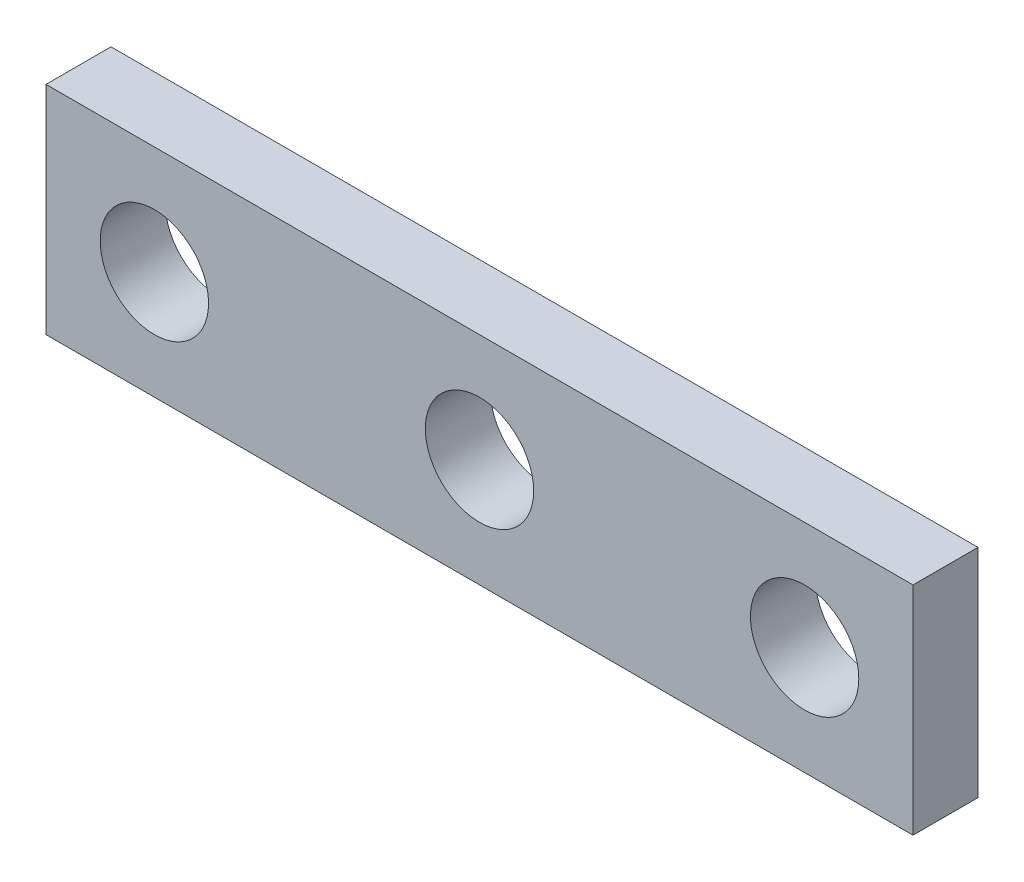
ISO-10303-21;
HEADER;
FILE_DESCRIPTION(('STEP AP214'),'2;1');
FILE_NAME('part.step','',(''),(''),'','','');
FILE_SCHEMA(('AUTOMOTIVE_DESIGN { 1 0 10303 214 1 1 1 1 }'));
ENDSEC;
DATA;
#1=APPLICATION_CONTEXT('core data for automotive mechanical design processes');
#2=APPLICATION_PROTOCOL_DEFINITION('international standard','automotive_design',2000,#1);
#3=PRODUCT_CONTEXT('',#1,'mechanical');
#4=PRODUCT('Part','Part','',(#3));
#5=PRODUCT_RELATED_PRODUCT_CATEGORY('part','',(#4));
#6=PRODUCT_DEFINITION_FORMATION('','',#4);
#7=PRODUCT_DEFINITION_CONTEXT('part definition',#1,'design');
#8=PRODUCT_DEFINITION('design','',#6,#7);
#9=PRODUCT_DEFINITION_SHAPE('','',#8);
#10=(LENGTH_UNIT() NAMED_UNIT(*) SI_UNIT(.MILLI.,.METRE.));
#11=(NAMED_UNIT(*) PLANE_ANGLE_UNIT() SI_UNIT($,.RADIAN.));
#12=(NAMED_UNIT(*) SI_UNIT($,.STERADIAN.) SOLID_ANGLE_UNIT());
#13=UNCERTAINTY_MEASURE_WITH_UNIT(LENGTH_MEASURE(1.E-05),#10,'distance_accuracy_value','');
#14=(GEOMETRIC_REPRESENTATION_CONTEXT(3) GLOBAL_UNCERTAINTY_ASSIGNED_CONTEXT((#13)) GLOBAL_UNIT_ASSIGNED_CONTEXT((#10,
#11,#12)) REPRESENTATION_CONTEXT('',''));
#15=CARTESIAN_POINT('',(0.,0.,0.));
#16=DIRECTION('',(0.,0.,1.));
#17=DIRECTION('',(1.,0.,0.));
#18=AXIS2_PLACEMENT_3D('',#15,#16,#17);
#19=CARTESIAN_POINT('',(0.,0.,3.));
#20=DIRECTION('',(0.,0.,-1.));
#21=DIRECTION('',(-1.,0.,0.));
#22=AXIS2_PLACEMENT_3D('',#19,#20,#21);
#23=PLANE('',#22);
#24=DIRECTION('',(0.,1.,0.));
#25=VECTOR('',#24,1.);
#26=CARTESIAN_POINT('',(20.,-5.,3.));
#27=LINE('',#26,#25);
#28=CARTESIAN_POINT('',(20.,-5.,3.));
#29=VERTEX_POINT('',#28);
#30=CARTESIAN_POINT('',(20.,5.,3.));
#31=VERTEX_POINT('',#30);
#32=EDGE_CURVE('E85',#29,#31,#27,.T.);
#33=ORIENTED_EDGE('',*,*,#32,.T.);
#34=DIRECTION('',(-1.,0.,0.));
#35=VECTOR('',#34,1.);
#36=CARTESIAN_POINT('',(-20.,5.,3.));
#37=LINE('',#36,#35);
#38=CARTESIAN_POINT('',(-20.,5.,3.));
#39=VERTEX_POINT('',#38);
#40=EDGE_CURVE('E80',#31,#39,#37,.T.);
#41=ORIENTED_EDGE('',*,*,#40,.T.);
#42=DIRECTION('',(0.,-1.,0.));
#43=VECTOR('',#42,1.);
#44=CARTESIAN_POINT('',(-20.,-5.,3.));
#45=LINE('',#44,#43);
#46=CARTESIAN_POINT('',(-20.,-5.,3.));
#47=VERTEX_POINT('',#46);
#48=EDGE_CURVE('E83',#39,#47,#45,.T.);
#49=ORIENTED_EDGE('',*,*,#48,.T.);
#50=DIRECTION('',(1.,0.,0.));
#51=VECTOR('',#50,1.);
#52=CARTESIAN_POINT('',(-20.,-5.,3.));
#53=LINE('',#52,#51);
#54=EDGE_CURVE('E50',#47,#29,#53,.T.);
#55=ORIENTED_EDGE('',*,*,#54,.T.);
#56=EDGE_LOOP('',(#33,#41,#49,#55));
#57=FACE_BOUND('',#56,.T.);
#58=CARTESIAN_POINT('',(-15.,0.,3.));
#59=DIRECTION('',(0.,0.,1.));
#60=DIRECTION('',(1.,0.,0.));
#61=AXIS2_PLACEMENT_3D('',#58,#59,#60);
#62=CIRCLE('',#61,2.5);
#63=CARTESIAN_POINT('',(-12.5,0.,3.));
#64=VERTEX_POINT('',#63);
#65=EDGE_CURVE('E100',#64,#64,#62,.T.);
#66=ORIENTED_EDGE('',*,*,#65,.F.);
#67=EDGE_LOOP('',(#66));
#68=FACE_BOUND('',#67,.T.);
#69=CARTESIAN_POINT('',(15.,0.,3.));
#70=DIRECTION('',(0.,0.,1.));
#71=DIRECTION('',(1.,0.,0.));
#72=AXIS2_PLACEMENT_3D('',#69,#70,#71);
#73=CIRCLE('',#72,2.5);
#74=CARTESIAN_POINT('',(17.5,0.,3.));
#75=VERTEX_POINT('',#74);
#76=EDGE_CURVE('E115',#75,#75,#73,.T.);
#77=ORIENTED_EDGE('',*,*,#76,.F.);
#78=EDGE_LOOP('',(#77));
#79=FACE_BOUND('',#78,.T.);
#80=CARTESIAN_POINT('',(0.,0.,3.));
#81=DIRECTION('',(0.,0.,1.));
#82=DIRECTION('',(1.,0.,0.));
#83=AXIS2_PLACEMENT_3D('',#80,#81,#82);
#84=CIRCLE('',#83,2.5);
#85=CARTESIAN_POINT('',(2.49999999999999,0.,3.));
#86=VERTEX_POINT('',#85);
#87=EDGE_CURVE('E121',#86,#86,#84,.T.);
#88=ORIENTED_EDGE('',*,*,#87,.F.);
#89=EDGE_LOOP('',(#88));
#90=FACE_BOUND('',#89,.T.);
#91=ADVANCED_FACE('F33',(#57,#68,#79,#90),#23,.F.);
#92=CARTESIAN_POINT('',(0.,0.,0.));
#93=DIRECTION('',(0.,0.,-1.));
#94=DIRECTION('',(-1.,0.,0.));
#95=AXIS2_PLACEMENT_3D('',#92,#93,#94);
#96=PLANE('',#95);
#97=CARTESIAN_POINT('',(15.,0.,0.));
#98=DIRECTION('',(0.,0.,1.));
#99=DIRECTION('',(1.,0.,0.));
#100=AXIS2_PLACEMENT_3D('',#97,#98,#99);
#101=CIRCLE('',#100,2.5);
#102=CARTESIAN_POINT('',(17.5,0.,0.));
#103=VERTEX_POINT('',#102);
#104=EDGE_CURVE('E118',#103,#103,#101,.T.);
#105=ORIENTED_EDGE('',*,*,#104,.T.);
#106=EDGE_LOOP('',(#105));
#107=FACE_BOUND('',#106,.T.);
#108=DIRECTION('',(0.,1.,0.));
#109=VECTOR('',#108,1.);
#110=CARTESIAN_POINT('',(20.,-5.,0.));
#111=LINE('',#110,#109);
#112=CARTESIAN_POINT('',(20.,-5.,0.));
#113=VERTEX_POINT('',#112);
#114=CARTESIAN_POINT('',(20.,5.,0.));
#115=VERTEX_POINT('',#114);
#116=EDGE_CURVE('E97',#113,#115,#111,.T.);
#117=ORIENTED_EDGE('',*,*,#116,.F.);
#118=DIRECTION('',(1.,0.,0.));
#119=VECTOR('',#118,1.);
#120=CARTESIAN_POINT('',(-20.,-5.,0.));
#121=LINE('',#120,#119);
#122=CARTESIAN_POINT('',(-20.,-5.,0.));
#123=VERTEX_POINT('',#122);
#124=EDGE_CURVE('E73',#123,#113,#121,.T.);
#125=ORIENTED_EDGE('',*,*,#124,.F.);
#126=DIRECTION('',(0.,-1.,0.));
#127=VECTOR('',#126,1.);
#128=CARTESIAN_POINT('',(-20.,-5.,0.));
#129=LINE('',#128,#127);
#130=CARTESIAN_POINT('',(-20.,5.,0.));
#131=VERTEX_POINT('',#130);
#132=EDGE_CURVE('E67',#131,#123,#129,.T.);
#133=ORIENTED_EDGE('',*,*,#132,.F.);
#134=DIRECTION('',(-1.,0.,0.));
#135=VECTOR('',#134,1.);
#136=CARTESIAN_POINT('',(-20.,5.,0.));
#137=LINE('',#136,#135);
#138=EDGE_CURVE('E89',#115,#131,#137,.T.);
#139=ORIENTED_EDGE('',*,*,#138,.F.);
#140=EDGE_LOOP('',(#117,#125,#133,#139));
#141=FACE_BOUND('',#140,.T.);
#142=CARTESIAN_POINT('',(-15.,0.,0.));
#143=DIRECTION('',(0.,0.,1.));
#144=DIRECTION('',(1.,0.,0.));
#145=AXIS2_PLACEMENT_3D('',#142,#143,#144);
#146=CIRCLE('',#145,2.5);
#147=CARTESIAN_POINT('',(-12.5,0.,0.));
#148=VERTEX_POINT('',#147);
#149=EDGE_CURVE('E112',#148,#148,#146,.T.);
#150=ORIENTED_EDGE('',*,*,#149,.T.);
#151=EDGE_LOOP('',(#150));
#152=FACE_BOUND('',#151,.T.);
#153=CARTESIAN_POINT('',(0.,0.,0.));
#154=DIRECTION('',(0.,0.,1.));
#155=DIRECTION('',(1.,0.,0.));
#156=AXIS2_PLACEMENT_3D('',#153,#154,#155);
#157=CIRCLE('',#156,2.5);
#158=CARTESIAN_POINT('',(2.49999999999999,0.,0.));
#159=VERTEX_POINT('',#158);
#160=EDGE_CURVE('E124',#159,#159,#157,.T.);
#161=ORIENTED_EDGE('',*,*,#160,.T.);
#162=EDGE_LOOP('',(#161));
#163=FACE_BOUND('',#162,.T.);
#164=ADVANCED_FACE('F108',(#107,#141,#152,#163),#96,.T.);
#165=CARTESIAN_POINT('',(20.,-5.,3.));
#166=DIRECTION('',(-1.,0.,0.));
#167=DIRECTION('',(0.,0.,1.));
#168=AXIS2_PLACEMENT_3D('',#165,#166,#167);
#169=PLANE('',#168);
#170=ORIENTED_EDGE('',*,*,#116,.T.);
#171=DIRECTION('',(0.,0.,-1.));
#172=VECTOR('',#171,1.);
#173=CARTESIAN_POINT('',(20.,5.,3.));
#174=LINE('',#173,#172);
#175=EDGE_CURVE('E11',#31,#115,#174,.T.);
#176=ORIENTED_EDGE('',*,*,#175,.F.);
#177=ORIENTED_EDGE('',*,*,#32,.F.);
#178=DIRECTION('',(0.,0.,-1.));
#179=VECTOR('',#178,1.);
#180=CARTESIAN_POINT('',(20.,-5.,3.));
#181=LINE('',#180,#179);
#182=EDGE_CURVE('E93',#29,#113,#181,.T.);
#183=ORIENTED_EDGE('',*,*,#182,.T.);
#184=EDGE_LOOP('',(#170,#176,#177,#183));
#185=FACE_BOUND('',#184,.T.);
#186=ADVANCED_FACE('F35',(#185),#169,.F.);
#187=CARTESIAN_POINT('',(-20.,5.,3.));
#188=DIRECTION('',(0.,-1.,0.));
#189=DIRECTION('',(0.,0.,-1.));
#190=AXIS2_PLACEMENT_3D('',#187,#188,#189);
#191=PLANE('',#190);
#192=ORIENTED_EDGE('',*,*,#138,.T.);
#193=DIRECTION('',(0.,0.,-1.));
#194=VECTOR('',#193,1.);
#195=CARTESIAN_POINT('',(-20.,5.,3.));
#196=LINE('',#195,#194);
#197=EDGE_CURVE('E42',#39,#131,#196,.T.);
#198=ORIENTED_EDGE('',*,*,#197,.F.);
#199=ORIENTED_EDGE('',*,*,#40,.F.);
#200=ORIENTED_EDGE('',*,*,#175,.T.);
#201=EDGE_LOOP('',(#192,#198,#199,#200));
#202=FACE_BOUND('',#201,.T.);
#203=ADVANCED_FACE('F88',(#202),#191,.F.);
#204=CARTESIAN_POINT('',(-20.,-5.,3.));
#205=DIRECTION('',(1.,0.,0.));
#206=DIRECTION('',(0.,0.,-1.));
#207=AXIS2_PLACEMENT_3D('',#204,#205,#206);
#208=PLANE('',#207);
#209=ORIENTED_EDGE('',*,*,#132,.T.);
#210=DIRECTION('',(0.,0.,-1.));
#211=VECTOR('',#210,1.);
#212=CARTESIAN_POINT('',(-20.,-5.,3.));
#213=LINE('',#212,#211);
#214=EDGE_CURVE('E90',#47,#123,#213,.T.);
#215=ORIENTED_EDGE('',*,*,#214,.F.);
#216=ORIENTED_EDGE('',*,*,#48,.F.);
#217=ORIENTED_EDGE('',*,*,#197,.T.);
#218=EDGE_LOOP('',(#209,#215,#216,#217));
#219=FACE_BOUND('',#218,.T.);
#220=ADVANCED_FACE('F91',(#219),#208,.F.);
#221=CARTESIAN_POINT('',(-20.,-5.,3.));
#222=DIRECTION('',(0.,1.,0.));
#223=DIRECTION('',(-1.,0.,0.));
#224=AXIS2_PLACEMENT_3D('',#221,#222,#223);
#225=PLANE('',#224);
#226=ORIENTED_EDGE('',*,*,#124,.T.);
#227=ORIENTED_EDGE('',*,*,#182,.F.);
#228=ORIENTED_EDGE('',*,*,#54,.F.);
#229=ORIENTED_EDGE('',*,*,#214,.T.);
#230=EDGE_LOOP('',(#226,#227,#228,#229));
#231=FACE_BOUND('',#230,.T.);
#232=ADVANCED_FACE('F105',(#231),#225,.F.);
#233=CARTESIAN_POINT('',(-15.,0.,3.));
#234=DIRECTION('',(0.,0.,-1.));
#235=DIRECTION('',(-1.,0.,0.));
#236=AXIS2_PLACEMENT_3D('',#233,#234,#235);
#237=CYLINDRICAL_SURFACE('',#236,2.5);
#238=ORIENTED_EDGE('',*,*,#65,.T.);
#239=EDGE_LOOP('',(#238));
#240=FACE_BOUND('',#239,.T.);
#241=ORIENTED_EDGE('',*,*,#149,.F.);
#242=EDGE_LOOP('',(#241));
#243=FACE_BOUND('',#242,.T.);
#244=ADVANCED_FACE('F141',(#240,#243),#237,.F.);
#245=CARTESIAN_POINT('',(15.,0.,3.));
#246=DIRECTION('',(0.,0.,-1.));
#247=DIRECTION('',(-1.,0.,0.));
#248=AXIS2_PLACEMENT_3D('',#245,#246,#247);
#249=CYLINDRICAL_SURFACE('',#248,2.5);
#250=ORIENTED_EDGE('',*,*,#76,.T.);
#251=EDGE_LOOP('',(#250));
#252=FACE_BOUND('',#251,.T.);
#253=ORIENTED_EDGE('',*,*,#104,.F.);
#254=EDGE_LOOP('',(#253));
#255=FACE_BOUND('',#254,.T.);
#256=ADVANCED_FACE('F187',(#252,#255),#249,.F.);
#257=CARTESIAN_POINT('',(0.,0.,3.));
#258=DIRECTION('',(0.,0.,-1.));
#259=DIRECTION('',(-1.,0.,0.));
#260=AXIS2_PLACEMENT_3D('',#257,#258,#259);
#261=CYLINDRICAL_SURFACE('',#260,2.5);
#262=ORIENTED_EDGE('',*,*,#87,.T.);
#263=EDGE_LOOP('',(#262));
#264=FACE_BOUND('',#263,.T.);
#265=ORIENTED_EDGE('',*,*,#160,.F.);
#266=EDGE_LOOP('',(#265));
#267=FACE_BOUND('',#266,.T.);
#268=ADVANCED_FACE('F130',(#264,#267),#261,.F.);
#269=CLOSED_SHELL('',(#91,#164,#186,#203,#220,#232,#244,#256,#268));
#270=MANIFOLD_SOLID_BREP('B2',#269);
#271=ADVANCED_BREP_SHAPE_REPRESENTATION('',(#18,#270),#14);
#272=SHAPE_DEFINITION_REPRESENTATION(#9,#271);
ENDSEC;
END-ISO-10303-21;
